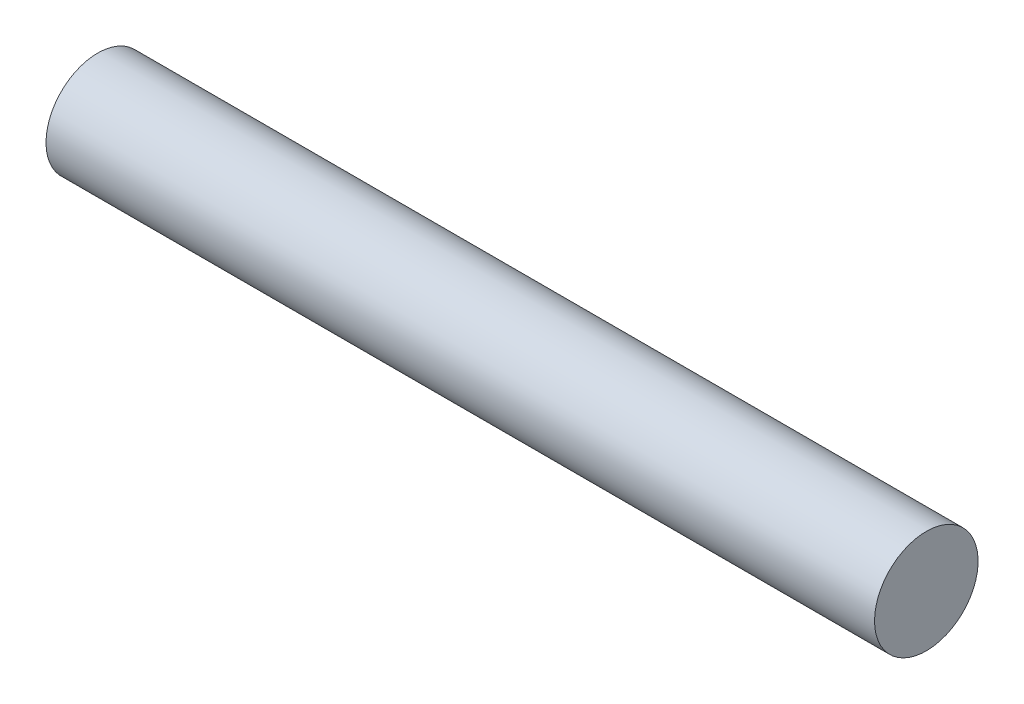
ISO-10303-21;
HEADER;
FILE_DESCRIPTION(('STEP AP214'),'2;1');
FILE_NAME('part.step','',(''),(''),'','','');
FILE_SCHEMA(('AUTOMOTIVE_DESIGN { 1 0 10303 214 1 1 1 1 }'));
ENDSEC;
DATA;
#1=APPLICATION_CONTEXT('core data for automotive mechanical design processes');
#2=APPLICATION_PROTOCOL_DEFINITION('international standard','automotive_design',2000,#1);
#3=PRODUCT_CONTEXT('',#1,'mechanical');
#4=PRODUCT('Part','Part','',(#3));
#5=PRODUCT_RELATED_PRODUCT_CATEGORY('part','',(#4));
#6=PRODUCT_DEFINITION_FORMATION('','',#4);
#7=PRODUCT_DEFINITION_CONTEXT('part definition',#1,'design');
#8=PRODUCT_DEFINITION('design','',#6,#7);
#9=PRODUCT_DEFINITION_SHAPE('','',#8);
#10=(LENGTH_UNIT() NAMED_UNIT(*) SI_UNIT(.MILLI.,.METRE.));
#11=(NAMED_UNIT(*) PLANE_ANGLE_UNIT() SI_UNIT($,.RADIAN.));
#12=(NAMED_UNIT(*) SI_UNIT($,.STERADIAN.) SOLID_ANGLE_UNIT());
#13=UNCERTAINTY_MEASURE_WITH_UNIT(LENGTH_MEASURE(1.E-05),#10,'distance_accuracy_value','');
#14=(GEOMETRIC_REPRESENTATION_CONTEXT(3) GLOBAL_UNCERTAINTY_ASSIGNED_CONTEXT((#13)) GLOBAL_UNIT_ASSIGNED_CONTEXT((#10,
#11,#12)) REPRESENTATION_CONTEXT('',''));
#15=CARTESIAN_POINT('',(0.,0.,0.));
#16=DIRECTION('',(0.,0.,1.));
#17=DIRECTION('',(1.,0.,0.));
#18=AXIS2_PLACEMENT_3D('',#15,#16,#17);
#19=CARTESIAN_POINT('',(19.05,0.,0.));
#20=DIRECTION('',(-1.,0.,0.));
#21=DIRECTION('',(0.,0.,1.));
#22=AXIS2_PLACEMENT_3D('',#19,#20,#21);
#23=CYLINDRICAL_SURFACE('',#22,2.38125);
#24=CARTESIAN_POINT('',(19.05,0.,0.));
#25=DIRECTION('',(1.,0.,0.));
#26=DIRECTION('',(0.,0.,-1.));
#27=AXIS2_PLACEMENT_3D('',#24,#25,#26);
#28=CIRCLE('',#27,2.38125);
#29=CARTESIAN_POINT('',(19.05,0.,2.38125));
#30=VERTEX_POINT('',#29);
#31=EDGE_CURVE('E10',#30,#30,#28,.T.);
#32=CARTESIAN_POINT('',(-19.05,0.,0.));
#33=DIRECTION('',(1.,0.,0.));
#34=DIRECTION('',(0.,0.,-1.));
#35=AXIS2_PLACEMENT_3D('',#32,#33,#34);
#36=CIRCLE('',#35,2.38125);
#37=CARTESIAN_POINT('',(-19.05,0.,2.38125));
#38=VERTEX_POINT('',#37);
#39=EDGE_CURVE('E40',#38,#38,#36,.T.);
#40=CARTESIAN_POINT('',(19.05,0.,2.38125));
#41=CARTESIAN_POINT('',(18.653125,0.,2.38125));
#42=CARTESIAN_POINT('',(18.25625,0.,2.38125));
#43=CARTESIAN_POINT('',(17.4625,0.,2.38125));
#44=CARTESIAN_POINT('',(17.065625,0.,2.38125));
#45=CARTESIAN_POINT('',(16.271875,0.,2.38125));
#46=CARTESIAN_POINT('',(15.875,0.,2.38125));
#47=CARTESIAN_POINT('',(15.08125,0.,2.38125));
#48=CARTESIAN_POINT('',(14.684375,0.,2.38125));
#49=CARTESIAN_POINT('',(13.890625,0.,2.38125));
#50=CARTESIAN_POINT('',(13.49375,0.,2.38125));
#51=CARTESIAN_POINT('',(12.7,0.,2.38125));
#52=CARTESIAN_POINT('',(12.303125,0.,2.38125));
#53=CARTESIAN_POINT('',(11.509375,0.,2.38125));
#54=CARTESIAN_POINT('',(11.1125,0.,2.38125));
#55=CARTESIAN_POINT('',(10.31875,0.,2.38125));
#56=CARTESIAN_POINT('',(9.921875,0.,2.38125));
#57=CARTESIAN_POINT('',(9.128125,0.,2.38125));
#58=CARTESIAN_POINT('',(8.73125,0.,2.38125));
#59=CARTESIAN_POINT('',(7.9375,0.,2.38125));
#60=CARTESIAN_POINT('',(7.540625,0.,2.38125));
#61=CARTESIAN_POINT('',(6.746875,0.,2.38125));
#62=CARTESIAN_POINT('',(6.35,0.,2.38125));
#63=CARTESIAN_POINT('',(5.55625,0.,2.38125));
#64=CARTESIAN_POINT('',(5.159375,0.,2.38125));
#65=CARTESIAN_POINT('',(4.365625,0.,2.38125));
#66=CARTESIAN_POINT('',(3.96875,0.,2.38125));
#67=CARTESIAN_POINT('',(3.175,0.,2.38125));
#68=CARTESIAN_POINT('',(2.778125,0.,2.38125));
#69=CARTESIAN_POINT('',(1.984375,0.,2.38125));
#70=CARTESIAN_POINT('',(1.5875,0.,2.38125));
#71=CARTESIAN_POINT('',(0.79375,0.,2.38125));
#72=CARTESIAN_POINT('',(0.396875,0.,2.38125));
#73=CARTESIAN_POINT('',(-0.396875,0.,2.38125));
#74=CARTESIAN_POINT('',(-0.79375,0.,2.38125));
#75=CARTESIAN_POINT('',(-1.5875,0.,2.38125));
#76=CARTESIAN_POINT('',(-1.984375,0.,2.38125));
#77=CARTESIAN_POINT('',(-2.778125,0.,2.38125));
#78=CARTESIAN_POINT('',(-3.175,0.,2.38125));
#79=CARTESIAN_POINT('',(-3.96875,0.,2.38125));
#80=CARTESIAN_POINT('',(-4.365625,0.,2.38125));
#81=CARTESIAN_POINT('',(-5.159375,0.,2.38125));
#82=CARTESIAN_POINT('',(-5.55625,0.,2.38125));
#83=CARTESIAN_POINT('',(-6.35,0.,2.38125));
#84=CARTESIAN_POINT('',(-6.746875,0.,2.38125));
#85=CARTESIAN_POINT('',(-7.540625,0.,2.38125));
#86=CARTESIAN_POINT('',(-7.9375,0.,2.38125));
#87=CARTESIAN_POINT('',(-8.73125,0.,2.38125));
#88=CARTESIAN_POINT('',(-9.128125,0.,2.38125));
#89=CARTESIAN_POINT('',(-9.921875,0.,2.38125));
#90=CARTESIAN_POINT('',(-10.31875,0.,2.38125));
#91=CARTESIAN_POINT('',(-11.1125,0.,2.38125));
#92=CARTESIAN_POINT('',(-11.509375,0.,2.38125));
#93=CARTESIAN_POINT('',(-12.303125,0.,2.38125));
#94=CARTESIAN_POINT('',(-12.7,0.,2.38125));
#95=CARTESIAN_POINT('',(-13.49375,0.,2.38125));
#96=CARTESIAN_POINT('',(-13.890625,0.,2.38125));
#97=CARTESIAN_POINT('',(-14.684375,0.,2.38125));
#98=CARTESIAN_POINT('',(-15.08125,0.,2.38125));
#99=CARTESIAN_POINT('',(-15.875,0.,2.38125));
#100=CARTESIAN_POINT('',(-16.271875,0.,2.38125));
#101=CARTESIAN_POINT('',(-17.065625,0.,2.38125));
#102=CARTESIAN_POINT('',(-17.4625,0.,2.38125));
#103=CARTESIAN_POINT('',(-18.25625,0.,2.38125));
#104=CARTESIAN_POINT('',(-18.653125,0.,2.38125));
#105=CARTESIAN_POINT('',(-19.05,0.,2.38125));
#106=B_SPLINE_CURVE_WITH_KNOTS('',3,(#40,#41,#42,#43,#44,#45,#46,#47,#48,#49,#50,#51,#52,#53,
#54,#55,#56,#57,#58,#59,#60,#61,#62,#63,#64,#65,#66,#67,#68,#69,#70,#71,#72,#73,#74,#75,#76,#77,
#78,#79,#80,#81,#82,#83,#84,#85,#86,#87,#88,#89,#90,#91,#92,#93,#94,#95,#96,#97,#98,#99,#100,
#101,#102,#103,#104,#105),.UNSPECIFIED.,.F.,.F.,(4,2,2,2,2,2,2,2,2,2,2,2,2,2,2,2,2,2,2,2,2,2,2,
2,2,2,2,2,2,2,2,2,4),(0.,1.190625,2.38125,3.571875,4.7625,5.953125,7.14375,8.334375,9.525,
10.715625,11.90625,13.096875,14.2875,15.478125,16.66875,17.859375,19.05,20.240625,21.43125,
22.621875,23.8125,25.003125,26.19375,27.384375,28.575,29.765625,30.95625,32.146875,33.3375,
34.528125,35.71875,36.909375,38.1),.UNSPECIFIED.);
#107=EDGE_CURVE('BSEAM37',#30,#38,#106,.T.);
#108=ORIENTED_EDGE('',*,*,#31,.F.);
#109=ORIENTED_EDGE('',*,*,#39,.T.);
#110=ORIENTED_EDGE('',*,*,#107,.T.);
#111=ORIENTED_EDGE('',*,*,#107,.F.);
#112=EDGE_LOOP('',(#108,#110,#109,#111));
#113=FACE_BOUND('',#112,.T.);
#114=ADVANCED_FACE('F37',(#113),#23,.T.);
#115=CARTESIAN_POINT('',(19.05,0.,0.));
#116=DIRECTION('',(1.,0.,0.));
#117=DIRECTION('',(0.,0.,-1.));
#118=AXIS2_PLACEMENT_3D('',#115,#116,#117);
#119=PLANE('',#118);
#120=ORIENTED_EDGE('',*,*,#31,.T.);
#121=EDGE_LOOP('',(#120));
#122=FACE_BOUND('',#121,.T.);
#123=ADVANCED_FACE('F52',(#122),#119,.T.);
#124=CARTESIAN_POINT('',(-19.05,0.,0.));
#125=DIRECTION('',(1.,0.,0.));
#126=DIRECTION('',(0.,0.,-1.));
#127=AXIS2_PLACEMENT_3D('',#124,#125,#126);
#128=PLANE('',#127);
#129=ORIENTED_EDGE('',*,*,#39,.F.);
#130=EDGE_LOOP('',(#129));
#131=FACE_BOUND('',#130,.T.);
#132=ADVANCED_FACE('F50',(#131),#128,.F.);
#133=CLOSED_SHELL('',(#114,#123,#132));
#134=MANIFOLD_SOLID_BREP('B2',#133);
#135=ADVANCED_BREP_SHAPE_REPRESENTATION('',(#18,#134),#14);
#136=SHAPE_DEFINITION_REPRESENTATION(#9,#135);
ENDSEC;
END-ISO-10303-21;
